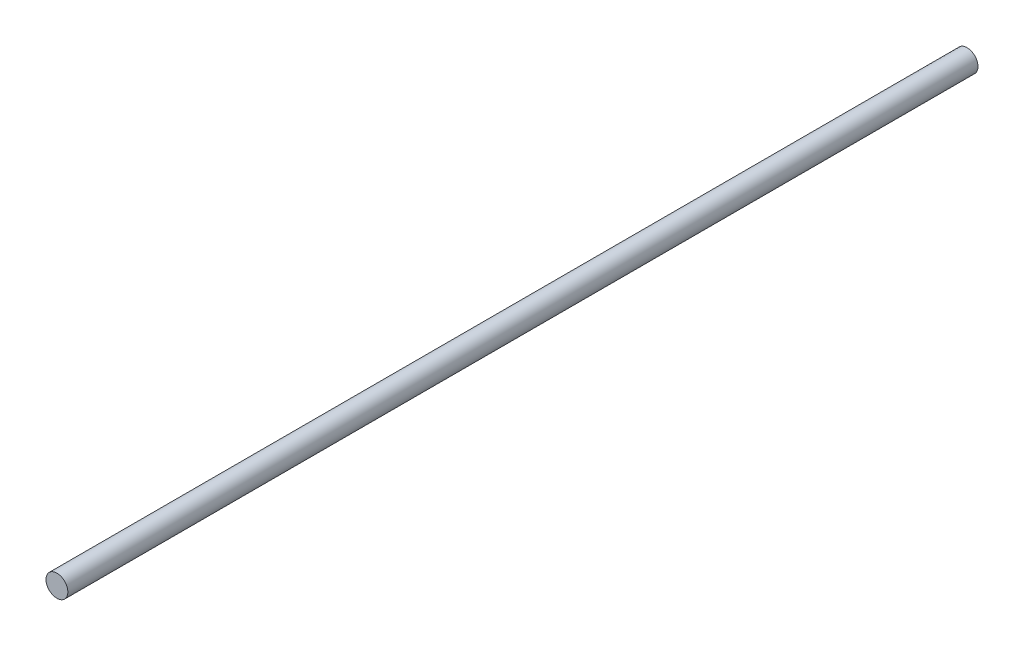
ISO-10303-21;
HEADER;
FILE_DESCRIPTION(('STEP AP214'),'2;1');
FILE_NAME('part.step','',(''),(''),'','','');
FILE_SCHEMA(('AUTOMOTIVE_DESIGN { 1 0 10303 214 1 1 1 1 }'));
ENDSEC;
DATA;
#1=APPLICATION_CONTEXT('core data for automotive mechanical design processes');
#2=APPLICATION_PROTOCOL_DEFINITION('international standard','automotive_design',2000,#1);
#3=PRODUCT_CONTEXT('',#1,'mechanical');
#4=PRODUCT('Part','Part','',(#3));
#5=PRODUCT_RELATED_PRODUCT_CATEGORY('part','',(#4));
#6=PRODUCT_DEFINITION_FORMATION('','',#4);
#7=PRODUCT_DEFINITION_CONTEXT('part definition',#1,'design');
#8=PRODUCT_DEFINITION('design','',#6,#7);
#9=PRODUCT_DEFINITION_SHAPE('','',#8);
#10=(LENGTH_UNIT() NAMED_UNIT(*) SI_UNIT(.MILLI.,.METRE.));
#11=(NAMED_UNIT(*) PLANE_ANGLE_UNIT() SI_UNIT($,.RADIAN.));
#12=(NAMED_UNIT(*) SI_UNIT($,.STERADIAN.) SOLID_ANGLE_UNIT());
#13=UNCERTAINTY_MEASURE_WITH_UNIT(LENGTH_MEASURE(1.E-05),#10,'distance_accuracy_value','');
#14=(GEOMETRIC_REPRESENTATION_CONTEXT(3) GLOBAL_UNCERTAINTY_ASSIGNED_CONTEXT((#13)) GLOBAL_UNIT_ASSIGNED_CONTEXT((#10,
#11,#12)) REPRESENTATION_CONTEXT('',''));
#15=CARTESIAN_POINT('',(0.,0.,0.));
#16=DIRECTION('',(0.,0.,1.));
#17=DIRECTION('',(1.,0.,0.));
#18=AXIS2_PLACEMENT_3D('',#15,#16,#17);
#19=CARTESIAN_POINT('',(0.,0.,500.));
#20=DIRECTION('',(0.,0.,-1.));
#21=DIRECTION('',(-1.,0.,0.));
#22=AXIS2_PLACEMENT_3D('',#19,#20,#21);
#23=CYLINDRICAL_SURFACE('',#22,6.);
#24=CARTESIAN_POINT('',(0.,0.,500.));
#25=DIRECTION('',(0.,0.,1.));
#26=DIRECTION('',(1.,0.,0.));
#27=AXIS2_PLACEMENT_3D('',#24,#25,#26);
#28=CIRCLE('',#27,6.);
#29=CARTESIAN_POINT('',(6.,0.,500.));
#30=VERTEX_POINT('',#29);
#31=EDGE_CURVE('E10',#30,#30,#28,.T.);
#32=ORIENTED_EDGE('',*,*,#31,.F.);
#33=EDGE_LOOP('',(#32));
#34=FACE_BOUND('',#33,.T.);
#35=CARTESIAN_POINT('',(0.,0.,0.));
#36=DIRECTION('',(0.,0.,1.));
#37=DIRECTION('',(1.,0.,0.));
#38=AXIS2_PLACEMENT_3D('',#35,#36,#37);
#39=CIRCLE('',#38,6.);
#40=CARTESIAN_POINT('',(6.,0.,0.));
#41=VERTEX_POINT('',#40);
#42=EDGE_CURVE('E37',#41,#41,#39,.T.);
#43=ORIENTED_EDGE('',*,*,#42,.T.);
#44=EDGE_LOOP('',(#43));
#45=FACE_BOUND('',#44,.T.);
#46=ADVANCED_FACE('F34',(#34,#45),#23,.T.);
#47=CARTESIAN_POINT('',(0.,0.,500.));
#48=DIRECTION('',(0.,0.,1.));
#49=DIRECTION('',(1.,0.,0.));
#50=AXIS2_PLACEMENT_3D('',#47,#48,#49);
#51=PLANE('',#50);
#52=ORIENTED_EDGE('',*,*,#31,.T.);
#53=EDGE_LOOP('',(#52));
#54=FACE_BOUND('',#53,.T.);
#55=ADVANCED_FACE('F49',(#54),#51,.T.);
#56=CARTESIAN_POINT('',(0.,0.,0.));
#57=DIRECTION('',(0.,0.,1.));
#58=DIRECTION('',(1.,0.,0.));
#59=AXIS2_PLACEMENT_3D('',#56,#57,#58);
#60=PLANE('',#59);
#61=ORIENTED_EDGE('',*,*,#42,.F.);
#62=EDGE_LOOP('',(#61));
#63=FACE_BOUND('',#62,.T.);
#64=ADVANCED_FACE('F47',(#63),#60,.F.);
#65=CLOSED_SHELL('',(#46,#55,#64));
#66=MANIFOLD_SOLID_BREP('B2',#65);
#67=ADVANCED_BREP_SHAPE_REPRESENTATION('',(#18,#66),#14);
#68=SHAPE_DEFINITION_REPRESENTATION(#9,#67);
ENDSEC;
END-ISO-10303-21;
